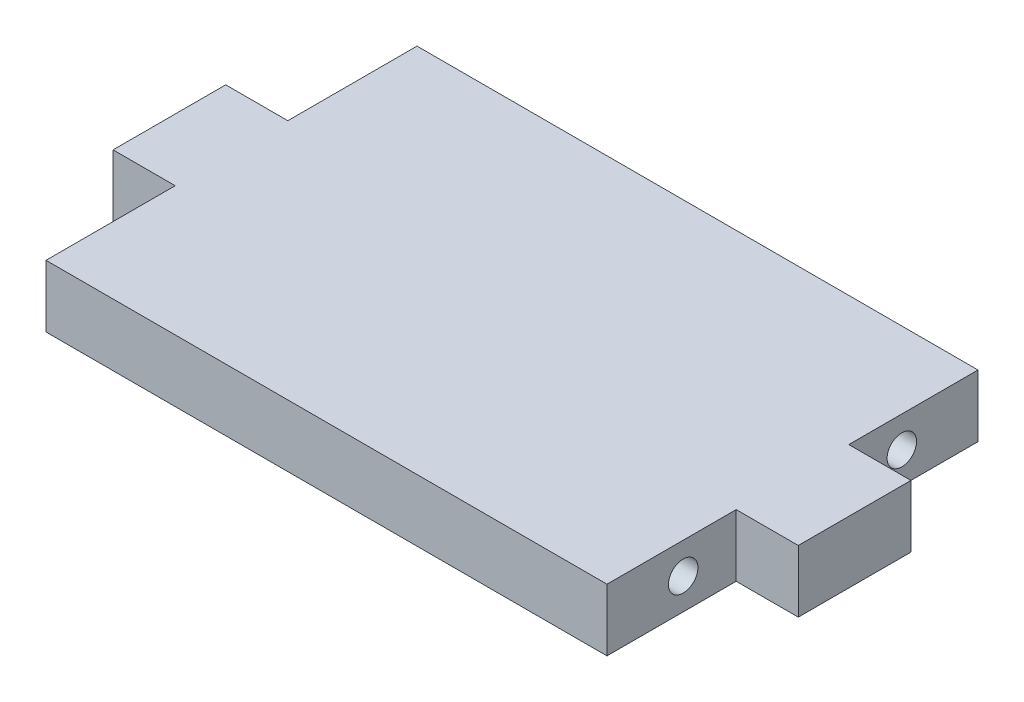
ISO-10303-21;
HEADER;
FILE_DESCRIPTION(('STEP AP214'),'2;1');
FILE_NAME('part.step','',(''),(''),'','','');
FILE_SCHEMA(('AUTOMOTIVE_DESIGN { 1 0 10303 214 1 1 1 1 }'));
ENDSEC;
DATA;
#1=APPLICATION_CONTEXT('core data for automotive mechanical design processes');
#2=APPLICATION_PROTOCOL_DEFINITION('international standard','automotive_design',2000,#1);
#3=PRODUCT_CONTEXT('',#1,'mechanical');
#4=PRODUCT('Part','Part','',(#3));
#5=PRODUCT_RELATED_PRODUCT_CATEGORY('part','',(#4));
#6=PRODUCT_DEFINITION_FORMATION('','',#4);
#7=PRODUCT_DEFINITION_CONTEXT('part definition',#1,'design');
#8=PRODUCT_DEFINITION('design','',#6,#7);
#9=PRODUCT_DEFINITION_SHAPE('','',#8);
#10=(LENGTH_UNIT() NAMED_UNIT(*) SI_UNIT(.MILLI.,.METRE.));
#11=(NAMED_UNIT(*) PLANE_ANGLE_UNIT() SI_UNIT($,.RADIAN.));
#12=(NAMED_UNIT(*) SI_UNIT($,.STERADIAN.) SOLID_ANGLE_UNIT());
#13=UNCERTAINTY_MEASURE_WITH_UNIT(LENGTH_MEASURE(1.E-05),#10,'distance_accuracy_value','');
#14=(GEOMETRIC_REPRESENTATION_CONTEXT(3) GLOBAL_UNCERTAINTY_ASSIGNED_CONTEXT((#13)) GLOBAL_UNIT_ASSIGNED_CONTEXT((#10,
#11,#12)) REPRESENTATION_CONTEXT('',''));
#15=CARTESIAN_POINT('',(0.,0.,0.));
#16=DIRECTION('',(0.,0.,1.));
#17=DIRECTION('',(1.,0.,0.));
#18=AXIS2_PLACEMENT_3D('',#15,#16,#17);
#19=CARTESIAN_POINT('',(-21.50745,4.7625,-14.224));
#20=DIRECTION('',(1.,0.,0.));
#21=DIRECTION('',(0.,0.,-1.));
#22=AXIS2_PLACEMENT_3D('',#19,#20,#21);
#23=PLANE('',#22);
#24=CARTESIAN_POINT('',(-21.50745,2.38125,-8.38199999999997));
#25=DIRECTION('',(1.,0.,0.));
#26=DIRECTION('',(0.,0.,-1.));
#27=AXIS2_PLACEMENT_3D('',#24,#25,#26);
#28=CIRCLE('',#27,1.1303);
#29=CARTESIAN_POINT('',(-21.50745,2.38125,-9.51229999999997));
#30=VERTEX_POINT('',#29);
#31=EDGE_CURVE('E262',#30,#30,#28,.T.);
#32=ORIENTED_EDGE('',*,*,#31,.T.);
#33=EDGE_LOOP('',(#32));
#34=FACE_BOUND('',#33,.T.);
#35=DIRECTION('',(0.,0.,1.));
#36=VECTOR('',#35,1.);
#37=CARTESIAN_POINT('',(-21.50745,0.,-14.224));
#38=LINE('',#37,#36);
#39=CARTESIAN_POINT('',(-21.50745,0.,-14.224));
#40=VERTEX_POINT('',#39);
#41=CARTESIAN_POINT('',(-21.50745,0.,-4.31800000000001));
#42=VERTEX_POINT('',#41);
#43=EDGE_CURVE('E153',#40,#42,#38,.T.);
#44=ORIENTED_EDGE('',*,*,#43,.T.);
#45=DIRECTION('',(0.,-1.,0.));
#46=VECTOR('',#45,1.);
#47=CARTESIAN_POINT('',(-21.50745,4.7625,-4.31800000000001));
#48=LINE('',#47,#46);
#49=CARTESIAN_POINT('',(-21.50745,4.7625,-4.31800000000001));
#50=VERTEX_POINT('',#49);
#51=EDGE_CURVE('E11',#50,#42,#48,.T.);
#52=ORIENTED_EDGE('',*,*,#51,.F.);
#53=DIRECTION('',(0.,0.,1.));
#54=VECTOR('',#53,1.);
#55=CARTESIAN_POINT('',(-21.50745,4.7625,-14.224));
#56=LINE('',#55,#54);
#57=CARTESIAN_POINT('',(-21.50745,4.7625,-14.224));
#58=VERTEX_POINT('',#57);
#59=EDGE_CURVE('E176',#58,#50,#56,.T.);
#60=ORIENTED_EDGE('',*,*,#59,.F.);
#61=DIRECTION('',(0.,-1.,0.));
#62=VECTOR('',#61,1.);
#63=CARTESIAN_POINT('',(-21.50745,4.7625,-14.224));
#64=LINE('',#63,#62);
#65=EDGE_CURVE('E149',#58,#40,#64,.T.);
#66=ORIENTED_EDGE('',*,*,#65,.T.);
#67=EDGE_LOOP('',(#44,#52,#60,#66));
#68=FACE_BOUND('',#67,.T.);
#69=ADVANCED_FACE('F33',(#34,#68),#23,.F.);
#70=CARTESIAN_POINT('',(-21.50745,4.7625,-4.31800000000001));
#71=DIRECTION('',(0.,0.,1.));
#72=DIRECTION('',(1.,0.,0.));
#73=AXIS2_PLACEMENT_3D('',#70,#71,#72);
#74=PLANE('',#73);
#75=DIRECTION('',(-1.,0.,0.));
#76=VECTOR('',#75,1.);
#77=CARTESIAN_POINT('',(-21.50745,0.,-4.31800000000001));
#78=LINE('',#77,#76);
#79=CARTESIAN_POINT('',(-26.26995,0.,-4.31800000000001));
#80=VERTEX_POINT('',#79);
#81=EDGE_CURVE('E156',#42,#80,#78,.T.);
#82=ORIENTED_EDGE('',*,*,#81,.T.);
#83=DIRECTION('',(0.,-1.,0.));
#84=VECTOR('',#83,1.);
#85=CARTESIAN_POINT('',(-26.26995,4.7625,-4.31800000000001));
#86=LINE('',#85,#84);
#87=CARTESIAN_POINT('',(-26.26995,4.7625,-4.31800000000001));
#88=VERTEX_POINT('',#87);
#89=EDGE_CURVE('E41',#88,#80,#86,.T.);
#90=ORIENTED_EDGE('',*,*,#89,.F.);
#91=DIRECTION('',(-1.,0.,0.));
#92=VECTOR('',#91,1.);
#93=CARTESIAN_POINT('',(-21.50745,4.7625,-4.31800000000001));
#94=LINE('',#93,#92);
#95=EDGE_CURVE('E104',#50,#88,#94,.T.);
#96=ORIENTED_EDGE('',*,*,#95,.F.);
#97=ORIENTED_EDGE('',*,*,#51,.T.);
#98=EDGE_LOOP('',(#82,#90,#96,#97));
#99=FACE_BOUND('',#98,.T.);
#100=ADVANCED_FACE('F255',(#99),#74,.F.);
#101=CARTESIAN_POINT('',(-26.26995,4.7625,-4.31800000000001));
#102=DIRECTION('',(1.,0.,0.));
#103=DIRECTION('',(0.,0.,-1.));
#104=AXIS2_PLACEMENT_3D('',#101,#102,#103);
#105=PLANE('',#104);
#106=DIRECTION('',(0.,0.,1.));
#107=VECTOR('',#106,1.);
#108=CARTESIAN_POINT('',(-26.26995,0.,-4.31800000000001));
#109=LINE('',#108,#107);
#110=CARTESIAN_POINT('',(-26.26995,0.,4.318));
#111=VERTEX_POINT('',#110);
#112=EDGE_CURVE('E159',#80,#111,#109,.T.);
#113=ORIENTED_EDGE('',*,*,#112,.T.);
#114=DIRECTION('',(0.,-1.,0.));
#115=VECTOR('',#114,1.);
#116=CARTESIAN_POINT('',(-26.26995,4.7625,4.318));
#117=LINE('',#116,#115);
#118=CARTESIAN_POINT('',(-26.26995,4.7625,4.318));
#119=VERTEX_POINT('',#118);
#120=EDGE_CURVE('E195',#119,#111,#117,.T.);
#121=ORIENTED_EDGE('',*,*,#120,.F.);
#122=DIRECTION('',(0.,0.,1.));
#123=VECTOR('',#122,1.);
#124=CARTESIAN_POINT('',(-26.26995,4.7625,-4.31800000000001));
#125=LINE('',#124,#123);
#126=EDGE_CURVE('E203',#88,#119,#125,.T.);
#127=ORIENTED_EDGE('',*,*,#126,.F.);
#128=ORIENTED_EDGE('',*,*,#89,.T.);
#129=EDGE_LOOP('',(#113,#121,#127,#128));
#130=FACE_BOUND('',#129,.T.);
#131=ADVANCED_FACE('F201',(#130),#105,.F.);
#132=CARTESIAN_POINT('',(-21.50745,4.7625,4.318));
#133=DIRECTION('',(0.,0.,-1.));
#134=DIRECTION('',(-1.,0.,0.));
#135=AXIS2_PLACEMENT_3D('',#132,#133,#134);
#136=PLANE('',#135);
#137=DIRECTION('',(1.,0.,0.));
#138=VECTOR('',#137,1.);
#139=CARTESIAN_POINT('',(-21.50745,0.,4.318));
#140=LINE('',#139,#138);
#141=CARTESIAN_POINT('',(-21.50745,0.,4.318));
#142=VERTEX_POINT('',#141);
#143=EDGE_CURVE('E161',#111,#142,#140,.T.);
#144=ORIENTED_EDGE('',*,*,#143,.T.);
#145=DIRECTION('',(0.,-1.,0.));
#146=VECTOR('',#145,1.);
#147=CARTESIAN_POINT('',(-21.50745,4.7625,4.318));
#148=LINE('',#147,#146);
#149=CARTESIAN_POINT('',(-21.50745,4.7625,4.318));
#150=VERTEX_POINT('',#149);
#151=EDGE_CURVE('E192',#150,#142,#148,.T.);
#152=ORIENTED_EDGE('',*,*,#151,.F.);
#153=DIRECTION('',(1.,0.,0.));
#154=VECTOR('',#153,1.);
#155=CARTESIAN_POINT('',(-21.50745,4.7625,4.318));
#156=LINE('',#155,#154);
#157=EDGE_CURVE('E221',#119,#150,#156,.T.);
#158=ORIENTED_EDGE('',*,*,#157,.F.);
#159=ORIENTED_EDGE('',*,*,#120,.T.);
#160=EDGE_LOOP('',(#144,#152,#158,#159));
#161=FACE_BOUND('',#160,.T.);
#162=ADVANCED_FACE('F212',(#161),#136,.F.);
#163=CARTESIAN_POINT('',(-21.50745,4.7625,14.224));
#164=DIRECTION('',(1.,0.,0.));
#165=DIRECTION('',(0.,0.,-1.));
#166=AXIS2_PLACEMENT_3D('',#163,#164,#165);
#167=PLANE('',#166);
#168=CARTESIAN_POINT('',(-21.50745,2.38125,8.38200000000003));
#169=DIRECTION('',(1.,0.,0.));
#170=DIRECTION('',(0.,0.,-1.));
#171=AXIS2_PLACEMENT_3D('',#168,#169,#170);
#172=CIRCLE('',#171,1.1303);
#173=CARTESIAN_POINT('',(-21.50745,2.38125,7.25170000000003));
#174=VERTEX_POINT('',#173);
#175=EDGE_CURVE('E157',#174,#174,#172,.T.);
#176=ORIENTED_EDGE('',*,*,#175,.T.);
#177=EDGE_LOOP('',(#176));
#178=FACE_BOUND('',#177,.T.);
#179=DIRECTION('',(0.,0.,1.));
#180=VECTOR('',#179,1.);
#181=CARTESIAN_POINT('',(-21.50745,0.,14.224));
#182=LINE('',#181,#180);
#183=CARTESIAN_POINT('',(-21.50745,0.,14.224));
#184=VERTEX_POINT('',#183);
#185=EDGE_CURVE('E163',#142,#184,#182,.T.);
#186=ORIENTED_EDGE('',*,*,#185,.T.);
#187=DIRECTION('',(0.,-1.,0.));
#188=VECTOR('',#187,1.);
#189=CARTESIAN_POINT('',(-21.50745,4.7625,14.224));
#190=LINE('',#189,#188);
#191=CARTESIAN_POINT('',(-21.50745,4.7625,14.224));
#192=VERTEX_POINT('',#191);
#193=EDGE_CURVE('E189',#192,#184,#190,.T.);
#194=ORIENTED_EDGE('',*,*,#193,.F.);
#195=DIRECTION('',(0.,0.,1.));
#196=VECTOR('',#195,1.);
#197=CARTESIAN_POINT('',(-21.50745,4.7625,14.224));
#198=LINE('',#197,#196);
#199=EDGE_CURVE('E218',#150,#192,#198,.T.);
#200=ORIENTED_EDGE('',*,*,#199,.F.);
#201=ORIENTED_EDGE('',*,*,#151,.T.);
#202=EDGE_LOOP('',(#186,#194,#200,#201));
#203=FACE_BOUND('',#202,.T.);
#204=ADVANCED_FACE('F216',(#178,#203),#167,.F.);
#205=CARTESIAN_POINT('',(-21.50745,4.7625,14.224));
#206=DIRECTION('',(0.,0.,-1.));
#207=DIRECTION('',(-1.,0.,0.));
#208=AXIS2_PLACEMENT_3D('',#205,#206,#207);
#209=PLANE('',#208);
#210=DIRECTION('',(1.,0.,0.));
#211=VECTOR('',#210,1.);
#212=CARTESIAN_POINT('',(-21.50745,0.,14.224));
#213=LINE('',#212,#211);
#214=CARTESIAN_POINT('',(21.50745,0.,14.224));
#215=VERTEX_POINT('',#214);
#216=EDGE_CURVE('E165',#184,#215,#213,.T.);
#217=ORIENTED_EDGE('',*,*,#216,.T.);
#218=DIRECTION('',(0.,-1.,0.));
#219=VECTOR('',#218,1.);
#220=CARTESIAN_POINT('',(21.50745,4.7625,14.224));
#221=LINE('',#220,#219);
#222=CARTESIAN_POINT('',(21.50745,4.7625,14.224));
#223=VERTEX_POINT('',#222);
#224=EDGE_CURVE('E186',#223,#215,#221,.T.);
#225=ORIENTED_EDGE('',*,*,#224,.F.);
#226=DIRECTION('',(1.,0.,0.));
#227=VECTOR('',#226,1.);
#228=CARTESIAN_POINT('',(-21.50745,4.7625,14.224));
#229=LINE('',#228,#227);
#230=EDGE_CURVE('E220',#192,#223,#229,.T.);
#231=ORIENTED_EDGE('',*,*,#230,.F.);
#232=ORIENTED_EDGE('',*,*,#193,.T.);
#233=EDGE_LOOP('',(#217,#225,#231,#232));
#234=FACE_BOUND('',#233,.T.);
#235=ADVANCED_FACE('F294',(#234),#209,.F.);
#236=CARTESIAN_POINT('',(21.50745,4.7625,14.224));
#237=DIRECTION('',(-1.,0.,0.));
#238=DIRECTION('',(0.,0.,1.));
#239=AXIS2_PLACEMENT_3D('',#236,#237,#238);
#240=PLANE('',#239);
#241=CARTESIAN_POINT('',(21.50745,2.38125,8.382));
#242=DIRECTION('',(1.,0.,0.));
#243=DIRECTION('',(0.,0.,-1.));
#244=AXIS2_PLACEMENT_3D('',#241,#242,#243);
#245=CIRCLE('',#244,1.1303);
#246=CARTESIAN_POINT('',(21.50745,2.38125,7.2517));
#247=VERTEX_POINT('',#246);
#248=EDGE_CURVE('E264',#247,#247,#245,.T.);
#249=ORIENTED_EDGE('',*,*,#248,.F.);
#250=EDGE_LOOP('',(#249));
#251=FACE_BOUND('',#250,.T.);
#252=DIRECTION('',(0.,0.,-1.));
#253=VECTOR('',#252,1.);
#254=CARTESIAN_POINT('',(21.50745,0.,14.224));
#255=LINE('',#254,#253);
#256=CARTESIAN_POINT('',(21.50745,0.,4.31799999999998));
#257=VERTEX_POINT('',#256);
#258=EDGE_CURVE('E167',#215,#257,#255,.T.);
#259=ORIENTED_EDGE('',*,*,#258,.T.);
#260=DIRECTION('',(0.,-1.,0.));
#261=VECTOR('',#260,1.);
#262=CARTESIAN_POINT('',(21.50745,4.7625,4.31799999999998));
#263=LINE('',#262,#261);
#264=CARTESIAN_POINT('',(21.50745,4.7625,4.31799999999998));
#265=VERTEX_POINT('',#264);
#266=EDGE_CURVE('E183',#265,#257,#263,.T.);
#267=ORIENTED_EDGE('',*,*,#266,.F.);
#268=DIRECTION('',(0.,0.,-1.));
#269=VECTOR('',#268,1.);
#270=CARTESIAN_POINT('',(21.50745,4.7625,14.224));
#271=LINE('',#270,#269);
#272=EDGE_CURVE('E223',#223,#265,#271,.T.);
#273=ORIENTED_EDGE('',*,*,#272,.F.);
#274=ORIENTED_EDGE('',*,*,#224,.T.);
#275=EDGE_LOOP('',(#259,#267,#273,#274));
#276=FACE_BOUND('',#275,.T.);
#277=ADVANCED_FACE('F291',(#251,#276),#240,.F.);
#278=CARTESIAN_POINT('',(21.50745,4.7625,4.31799999999998));
#279=DIRECTION('',(0.,0.,-1.));
#280=DIRECTION('',(-1.,0.,0.));
#281=AXIS2_PLACEMENT_3D('',#278,#279,#280);
#282=PLANE('',#281);
#283=DIRECTION('',(1.,0.,0.));
#284=VECTOR('',#283,1.);
#285=CARTESIAN_POINT('',(21.50745,0.,4.31799999999998));
#286=LINE('',#285,#284);
#287=CARTESIAN_POINT('',(26.26995,0.,4.31799999999998));
#288=VERTEX_POINT('',#287);
#289=EDGE_CURVE('E169',#257,#288,#286,.T.);
#290=ORIENTED_EDGE('',*,*,#289,.T.);
#291=DIRECTION('',(0.,-1.,0.));
#292=VECTOR('',#291,1.);
#293=CARTESIAN_POINT('',(26.26995,4.7625,4.31799999999998));
#294=LINE('',#293,#292);
#295=CARTESIAN_POINT('',(26.26995,4.7625,4.31799999999998));
#296=VERTEX_POINT('',#295);
#297=EDGE_CURVE('E180',#296,#288,#294,.T.);
#298=ORIENTED_EDGE('',*,*,#297,.F.);
#299=DIRECTION('',(1.,0.,0.));
#300=VECTOR('',#299,1.);
#301=CARTESIAN_POINT('',(21.50745,4.7625,4.31799999999998));
#302=LINE('',#301,#300);
#303=EDGE_CURVE('E229',#265,#296,#302,.T.);
#304=ORIENTED_EDGE('',*,*,#303,.F.);
#305=ORIENTED_EDGE('',*,*,#266,.T.);
#306=EDGE_LOOP('',(#290,#298,#304,#305));
#307=FACE_BOUND('',#306,.T.);
#308=ADVANCED_FACE('F235',(#307),#282,.F.);
#309=CARTESIAN_POINT('',(26.26995,4.7625,-4.31800000000001));
#310=DIRECTION('',(-1.,0.,0.));
#311=DIRECTION('',(0.,0.,1.));
#312=AXIS2_PLACEMENT_3D('',#309,#310,#311);
#313=PLANE('',#312);
#314=DIRECTION('',(0.,0.,-1.));
#315=VECTOR('',#314,1.);
#316=CARTESIAN_POINT('',(26.26995,0.,-4.31800000000001));
#317=LINE('',#316,#315);
#318=CARTESIAN_POINT('',(26.26995,0.,-4.31800000000001));
#319=VERTEX_POINT('',#318);
#320=EDGE_CURVE('E171',#288,#319,#317,.T.);
#321=ORIENTED_EDGE('',*,*,#320,.T.);
#322=DIRECTION('',(0.,-1.,0.));
#323=VECTOR('',#322,1.);
#324=CARTESIAN_POINT('',(26.26995,4.7625,-4.31800000000001));
#325=LINE('',#324,#323);
#326=CARTESIAN_POINT('',(26.26995,4.7625,-4.31800000000001));
#327=VERTEX_POINT('',#326);
#328=EDGE_CURVE('E144',#327,#319,#325,.T.);
#329=ORIENTED_EDGE('',*,*,#328,.F.);
#330=DIRECTION('',(0.,0.,-1.));
#331=VECTOR('',#330,1.);
#332=CARTESIAN_POINT('',(26.26995,4.7625,-4.31800000000001));
#333=LINE('',#332,#331);
#334=EDGE_CURVE('E135',#296,#327,#333,.T.);
#335=ORIENTED_EDGE('',*,*,#334,.F.);
#336=ORIENTED_EDGE('',*,*,#297,.T.);
#337=EDGE_LOOP('',(#321,#329,#335,#336));
#338=FACE_BOUND('',#337,.T.);
#339=ADVANCED_FACE('F239',(#338),#313,.F.);
#340=CARTESIAN_POINT('',(21.50745,4.7625,-4.31800000000001));
#341=DIRECTION('',(0.,0.,1.));
#342=DIRECTION('',(1.,0.,0.));
#343=AXIS2_PLACEMENT_3D('',#340,#341,#342);
#344=PLANE('',#343);
#345=DIRECTION('',(-1.,0.,0.));
#346=VECTOR('',#345,1.);
#347=CARTESIAN_POINT('',(21.50745,0.,-4.31800000000001));
#348=LINE('',#347,#346);
#349=CARTESIAN_POINT('',(21.50745,0.,-4.31800000000001));
#350=VERTEX_POINT('',#349);
#351=EDGE_CURVE('E143',#319,#350,#348,.T.);
#352=ORIENTED_EDGE('',*,*,#351,.T.);
#353=DIRECTION('',(0.,-1.,0.));
#354=VECTOR('',#353,1.);
#355=CARTESIAN_POINT('',(21.50745,4.7625,-4.31800000000001));
#356=LINE('',#355,#354);
#357=CARTESIAN_POINT('',(21.50745,4.7625,-4.31800000000001));
#358=VERTEX_POINT('',#357);
#359=EDGE_CURVE('E140',#358,#350,#356,.T.);
#360=ORIENTED_EDGE('',*,*,#359,.F.);
#361=DIRECTION('',(-1.,0.,0.));
#362=VECTOR('',#361,1.);
#363=CARTESIAN_POINT('',(21.50745,4.7625,-4.31800000000001));
#364=LINE('',#363,#362);
#365=EDGE_CURVE('E129',#327,#358,#364,.T.);
#366=ORIENTED_EDGE('',*,*,#365,.F.);
#367=ORIENTED_EDGE('',*,*,#328,.T.);
#368=EDGE_LOOP('',(#352,#360,#366,#367));
#369=FACE_BOUND('',#368,.T.);
#370=ADVANCED_FACE('F141',(#369),#344,.F.);
#371=CARTESIAN_POINT('',(21.50745,4.7625,-14.224));
#372=DIRECTION('',(-1.,0.,0.));
#373=DIRECTION('',(0.,0.,1.));
#374=AXIS2_PLACEMENT_3D('',#371,#372,#373);
#375=PLANE('',#374);
#376=CARTESIAN_POINT('',(21.50745,2.38125,-8.382));
#377=DIRECTION('',(1.,0.,0.));
#378=DIRECTION('',(0.,0.,-1.));
#379=AXIS2_PLACEMENT_3D('',#376,#377,#378);
#380=CIRCLE('',#379,1.1303);
#381=CARTESIAN_POINT('',(21.50745,2.38125,-9.5123));
#382=VERTEX_POINT('',#381);
#383=EDGE_CURVE('E265',#382,#382,#380,.T.);
#384=ORIENTED_EDGE('',*,*,#383,.F.);
#385=EDGE_LOOP('',(#384));
#386=FACE_BOUND('',#385,.T.);
#387=DIRECTION('',(0.,0.,-1.));
#388=VECTOR('',#387,1.);
#389=CARTESIAN_POINT('',(21.50745,0.,-14.224));
#390=LINE('',#389,#388);
#391=CARTESIAN_POINT('',(21.50745,0.,-14.224));
#392=VERTEX_POINT('',#391);
#393=EDGE_CURVE('E90',#350,#392,#390,.T.);
#394=ORIENTED_EDGE('',*,*,#393,.T.);
#395=DIRECTION('',(0.,-1.,0.));
#396=VECTOR('',#395,1.);
#397=CARTESIAN_POINT('',(21.50745,4.7625,-14.224));
#398=LINE('',#397,#396);
#399=CARTESIAN_POINT('',(21.50745,4.7625,-14.224));
#400=VERTEX_POINT('',#399);
#401=EDGE_CURVE('E145',#400,#392,#398,.T.);
#402=ORIENTED_EDGE('',*,*,#401,.F.);
#403=DIRECTION('',(0.,0.,-1.));
#404=VECTOR('',#403,1.);
#405=CARTESIAN_POINT('',(21.50745,4.7625,-14.224));
#406=LINE('',#405,#404);
#407=EDGE_CURVE('E133',#358,#400,#406,.T.);
#408=ORIENTED_EDGE('',*,*,#407,.F.);
#409=ORIENTED_EDGE('',*,*,#359,.T.);
#410=EDGE_LOOP('',(#394,#402,#408,#409));
#411=FACE_BOUND('',#410,.T.);
#412=ADVANCED_FACE('F147',(#386,#411),#375,.F.);
#413=CARTESIAN_POINT('',(-21.50745,4.7625,-14.224));
#414=DIRECTION('',(0.,0.,1.));
#415=DIRECTION('',(1.,0.,0.));
#416=AXIS2_PLACEMENT_3D('',#413,#414,#415);
#417=PLANE('',#416);
#418=DIRECTION('',(-1.,0.,0.));
#419=VECTOR('',#418,1.);
#420=CARTESIAN_POINT('',(-21.50745,0.,-14.224));
#421=LINE('',#420,#419);
#422=EDGE_CURVE('E96',#392,#40,#421,.T.);
#423=ORIENTED_EDGE('',*,*,#422,.T.);
#424=ORIENTED_EDGE('',*,*,#65,.F.);
#425=DIRECTION('',(-1.,0.,0.));
#426=VECTOR('',#425,1.);
#427=CARTESIAN_POINT('',(-21.50745,4.7625,-14.224));
#428=LINE('',#427,#426);
#429=EDGE_CURVE('E49',#400,#58,#428,.T.);
#430=ORIENTED_EDGE('',*,*,#429,.F.);
#431=ORIENTED_EDGE('',*,*,#401,.T.);
#432=EDGE_LOOP('',(#423,#424,#430,#431));
#433=FACE_BOUND('',#432,.T.);
#434=ADVANCED_FACE('F243',(#433),#417,.F.);
#435=CARTESIAN_POINT('',(-21.50745,4.7625,-4.31800000000001));
#436=DIRECTION('',(0.,-1.,0.));
#437=DIRECTION('',(0.,0.,-1.));
#438=AXIS2_PLACEMENT_3D('',#435,#436,#437);
#439=PLANE('',#438);
#440=ORIENTED_EDGE('',*,*,#59,.T.);
#441=ORIENTED_EDGE('',*,*,#95,.T.);
#442=ORIENTED_EDGE('',*,*,#126,.T.);
#443=ORIENTED_EDGE('',*,*,#157,.T.);
#444=ORIENTED_EDGE('',*,*,#199,.T.);
#445=ORIENTED_EDGE('',*,*,#230,.T.);
#446=ORIENTED_EDGE('',*,*,#272,.T.);
#447=ORIENTED_EDGE('',*,*,#303,.T.);
#448=ORIENTED_EDGE('',*,*,#334,.T.);
#449=ORIENTED_EDGE('',*,*,#365,.T.);
#450=ORIENTED_EDGE('',*,*,#407,.T.);
#451=ORIENTED_EDGE('',*,*,#429,.T.);
#452=EDGE_LOOP('',(#440,#441,#442,#443,#444,#445,#446,#447,#448,#449,#450,#451));
#453=FACE_BOUND('',#452,.T.);
#454=ADVANCED_FACE('F131',(#453),#439,.F.);
#455=CARTESIAN_POINT('',(-21.50745,0.,-4.31800000000001));
#456=DIRECTION('',(0.,-1.,0.));
#457=DIRECTION('',(0.,0.,-1.));
#458=AXIS2_PLACEMENT_3D('',#455,#456,#457);
#459=PLANE('',#458);
#460=ORIENTED_EDGE('',*,*,#43,.F.);
#461=ORIENTED_EDGE('',*,*,#422,.F.);
#462=ORIENTED_EDGE('',*,*,#393,.F.);
#463=ORIENTED_EDGE('',*,*,#351,.F.);
#464=ORIENTED_EDGE('',*,*,#320,.F.);
#465=ORIENTED_EDGE('',*,*,#289,.F.);
#466=ORIENTED_EDGE('',*,*,#258,.F.);
#467=ORIENTED_EDGE('',*,*,#216,.F.);
#468=ORIENTED_EDGE('',*,*,#185,.F.);
#469=ORIENTED_EDGE('',*,*,#143,.F.);
#470=ORIENTED_EDGE('',*,*,#112,.F.);
#471=ORIENTED_EDGE('',*,*,#81,.F.);
#472=EDGE_LOOP('',(#460,#461,#462,#463,#464,#465,#466,#467,#468,#469,#470,#471));
#473=FACE_BOUND('',#472,.T.);
#474=ADVANCED_FACE('F207',(#473),#459,.T.);
#475=CARTESIAN_POINT('',(-26.26995,2.38125,8.38200000000004));
#476=DIRECTION('',(1.,0.,0.));
#477=DIRECTION('',(0.,0.,-1.));
#478=AXIS2_PLACEMENT_3D('',#475,#476,#477);
#479=CYLINDRICAL_SURFACE('',#478,1.1303);
#480=ORIENTED_EDGE('',*,*,#248,.T.);
#481=EDGE_LOOP('',(#480));
#482=FACE_BOUND('',#481,.T.);
#483=ORIENTED_EDGE('',*,*,#175,.F.);
#484=EDGE_LOOP('',(#483));
#485=FACE_BOUND('',#484,.T.);
#486=ADVANCED_FACE('F278',(#482,#485),#479,.F.);
#487=CARTESIAN_POINT('',(-26.26995,2.38125,-8.38199999999997));
#488=DIRECTION('',(1.,0.,0.));
#489=DIRECTION('',(0.,0.,-1.));
#490=AXIS2_PLACEMENT_3D('',#487,#488,#489);
#491=CYLINDRICAL_SURFACE('',#490,1.1303);
#492=ORIENTED_EDGE('',*,*,#383,.T.);
#493=EDGE_LOOP('',(#492));
#494=FACE_BOUND('',#493,.T.);
#495=ORIENTED_EDGE('',*,*,#31,.F.);
#496=EDGE_LOOP('',(#495));
#497=FACE_BOUND('',#496,.T.);
#498=ADVANCED_FACE('F280',(#494,#497),#491,.F.);
#499=CLOSED_SHELL('',(#69,#100,#131,#162,#204,#235,#277,#308,#339,#370,#412,#434,#454,#474,#486,#498));
#500=MANIFOLD_SOLID_BREP('B2',#499);
#501=ADVANCED_BREP_SHAPE_REPRESENTATION('',(#18,#500),#14);
#502=SHAPE_DEFINITION_REPRESENTATION(#9,#501);
ENDSEC;
END-ISO-10303-21;
